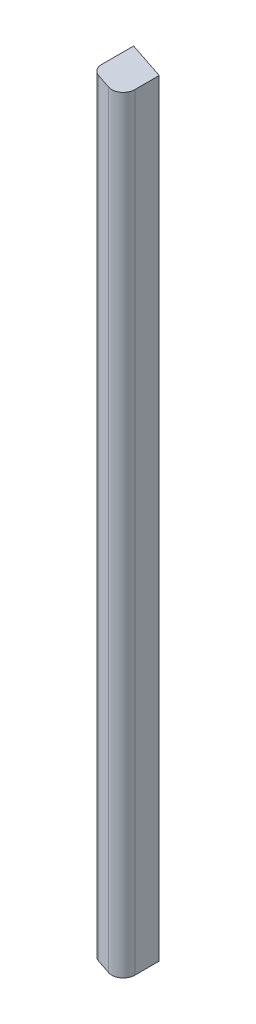
ISO-10303-21;
HEADER;
FILE_DESCRIPTION(('STEP AP214'),'2;1');
FILE_NAME('part.step','',(''),(''),'','','');
FILE_SCHEMA(('AUTOMOTIVE_DESIGN { 1 0 10303 214 1 1 1 1 }'));
ENDSEC;
DATA;
#1=APPLICATION_CONTEXT('core data for automotive mechanical design processes');
#2=APPLICATION_PROTOCOL_DEFINITION('international standard','automotive_design',2000,#1);
#3=PRODUCT_CONTEXT('',#1,'mechanical');
#4=PRODUCT('Part','Part','',(#3));
#5=PRODUCT_RELATED_PRODUCT_CATEGORY('part','',(#4));
#6=PRODUCT_DEFINITION_FORMATION('','',#4);
#7=PRODUCT_DEFINITION_CONTEXT('part definition',#1,'design');
#8=PRODUCT_DEFINITION('design','',#6,#7);
#9=PRODUCT_DEFINITION_SHAPE('','',#8);
#10=(LENGTH_UNIT() NAMED_UNIT(*) SI_UNIT(.MILLI.,.METRE.));
#11=(NAMED_UNIT(*) PLANE_ANGLE_UNIT() SI_UNIT($,.RADIAN.));
#12=(NAMED_UNIT(*) SI_UNIT($,.STERADIAN.) SOLID_ANGLE_UNIT());
#13=UNCERTAINTY_MEASURE_WITH_UNIT(LENGTH_MEASURE(1.E-05),#10,'distance_accuracy_value','');
#14=(GEOMETRIC_REPRESENTATION_CONTEXT(3) GLOBAL_UNCERTAINTY_ASSIGNED_CONTEXT((#13)) GLOBAL_UNIT_ASSIGNED_CONTEXT((#10,
#11,#12)) REPRESENTATION_CONTEXT('',''));
#15=CARTESIAN_POINT('',(0.,0.,0.));
#16=DIRECTION('',(0.,0.,1.));
#17=DIRECTION('',(1.,0.,0.));
#18=AXIS2_PLACEMENT_3D('',#15,#16,#17);
#19=CARTESIAN_POINT('',(-2.747264848109,10.86,8.977774605995));
#20=DIRECTION('',(0.315098987391905,0.,-0.949058811741715));
#21=DIRECTION('',(-0.949058811741715,0.,-0.315098987391905));
#22=AXIS2_PLACEMENT_3D('',#19,#20,#21);
#23=PLANE('',#22);
#24=DIRECTION('',(-0.949058811741715,0.,-0.315098987391905));
#25=VECTOR('',#24,1.);
#26=CARTESIAN_POINT('',(-2.747264848109,10.86,8.977774605995));
#27=LINE('',#26,#25);
#28=CARTESIAN_POINT('',(-2.947264848109,10.86,8.91137219057146));
#29=VERTEX_POINT('',#28);
#30=CARTESIAN_POINT('',(-2.74726484810889,10.86,8.97777460599463));
#31=VERTEX_POINT('',#30);
#32=EDGE_CURVE('E74',#29,#31,#27,.F.);
#33=ORIENTED_EDGE('',*,*,#32,.F.);
#34=DIRECTION('',(0.,-1.,0.));
#35=VECTOR('',#34,1.);
#36=CARTESIAN_POINT('',(-2.94726484810906,10.86,8.91137219057117));
#37=LINE('',#36,#35);
#38=CARTESIAN_POINT('',(-2.947264848109,0.86,8.91137219057146));
#39=VERTEX_POINT('',#38);
#40=EDGE_CURVE('E119',#39,#29,#37,.F.);
#41=ORIENTED_EDGE('',*,*,#40,.F.);
#42=DIRECTION('',(-0.949058811741715,0.,-0.315098987391905));
#43=VECTOR('',#42,1.);
#44=CARTESIAN_POINT('',(-2.747264848109,0.86,8.977774605995));
#45=LINE('',#44,#43);
#46=CARTESIAN_POINT('',(-2.74726484810889,0.86,8.97777460599463));
#47=VERTEX_POINT('',#46);
#48=EDGE_CURVE('E130',#47,#39,#45,.T.);
#49=ORIENTED_EDGE('',*,*,#48,.F.);
#50=DIRECTION('',(0.,-1.,0.));
#51=VECTOR('',#50,1.);
#52=CARTESIAN_POINT('',(-2.74726484810876,10.86,8.97777460599427));
#53=LINE('',#52,#51);
#54=EDGE_CURVE('E78',#31,#47,#53,.T.);
#55=ORIENTED_EDGE('',*,*,#54,.F.);
#56=EDGE_LOOP('',(#33,#41,#49,#55));
#57=FACE_BOUND('',#56,.T.);
#58=ADVANCED_FACE('F17',(#57),#23,.F.);
#59=CARTESIAN_POINT('',(-2.7,10.86,8.835415784233));
#60=DIRECTION('',(0.,-1.,0.));
#61=DIRECTION('',(0.,0.,-1.));
#62=AXIS2_PLACEMENT_3D('',#59,#60,#61);
#63=CYLINDRICAL_SURFACE('',#62,0.15);
#64=CARTESIAN_POINT('',(-2.7,0.86,8.835415784233));
#65=DIRECTION('',(0.,-1.,0.));
#66=DIRECTION('',(0.,0.,-1.));
#67=AXIS2_PLACEMENT_3D('',#64,#65,#66);
#68=CIRCLE('',#67,0.15);
#69=CARTESIAN_POINT('',(-2.55,0.86,8.835415784233));
#70=VERTEX_POINT('',#69);
#71=EDGE_CURVE('E83',#70,#47,#68,.T.);
#72=ORIENTED_EDGE('',*,*,#71,.F.);
#73=DIRECTION('',(0.,1.,0.));
#74=VECTOR('',#73,1.);
#75=CARTESIAN_POINT('',(-2.55,10.86,8.835415784233));
#76=LINE('',#75,#74);
#77=CARTESIAN_POINT('',(-2.55,10.86,8.835415784233));
#78=VERTEX_POINT('',#77);
#79=EDGE_CURVE('E80',#70,#78,#76,.T.);
#80=ORIENTED_EDGE('',*,*,#79,.T.);
#81=CARTESIAN_POINT('',(-2.7,10.86,8.835415784233));
#82=DIRECTION('',(0.,-1.,0.));
#83=DIRECTION('',(0.,0.,-1.));
#84=AXIS2_PLACEMENT_3D('',#81,#82,#83);
#85=CIRCLE('',#84,0.15);
#86=EDGE_CURVE('E20',#78,#31,#85,.T.);
#87=ORIENTED_EDGE('',*,*,#86,.T.);
#88=ORIENTED_EDGE('',*,*,#54,.T.);
#89=EDGE_LOOP('',(#72,#80,#87,#88));
#90=FACE_BOUND('',#89,.T.);
#91=ADVANCED_FACE('F81',(#90),#63,.T.);
#92=CARTESIAN_POINT('',(-2.9,10.86,8.76901336881));
#93=DIRECTION('',(0.,-1.,0.));
#94=DIRECTION('',(0.,0.,-1.));
#95=AXIS2_PLACEMENT_3D('',#92,#93,#94);
#96=CYLINDRICAL_SURFACE('',#95,0.15);
#97=CARTESIAN_POINT('',(-2.9,0.86,8.76901336881));
#98=DIRECTION('',(0.,-1.,0.));
#99=DIRECTION('',(0.,0.,-1.));
#100=AXIS2_PLACEMENT_3D('',#97,#98,#99);
#101=CIRCLE('',#100,0.15);
#102=CARTESIAN_POINT('',(-3.05,0.86,8.76901336881));
#103=VERTEX_POINT('',#102);
#104=EDGE_CURVE('E121',#39,#103,#101,.T.);
#105=ORIENTED_EDGE('',*,*,#104,.F.);
#106=ORIENTED_EDGE('',*,*,#40,.T.);
#107=CARTESIAN_POINT('',(-2.9,10.86,8.76901336881));
#108=DIRECTION('',(0.,-1.,0.));
#109=DIRECTION('',(0.,0.,-1.));
#110=AXIS2_PLACEMENT_3D('',#107,#108,#109);
#111=CIRCLE('',#110,0.15);
#112=CARTESIAN_POINT('',(-3.05,10.86,8.76901336881));
#113=VERTEX_POINT('',#112);
#114=EDGE_CURVE('E92',#29,#113,#111,.T.);
#115=ORIENTED_EDGE('',*,*,#114,.T.);
#116=DIRECTION('',(0.,1.,0.));
#117=VECTOR('',#116,1.);
#118=CARTESIAN_POINT('',(-3.05,10.86,8.76901336881));
#119=LINE('',#118,#117);
#120=EDGE_CURVE('E99',#113,#103,#119,.F.);
#121=ORIENTED_EDGE('',*,*,#120,.T.);
#122=EDGE_LOOP('',(#105,#106,#115,#121));
#123=FACE_BOUND('',#122,.T.);
#124=ADVANCED_FACE('F140',(#123),#96,.T.);
#125=CARTESIAN_POINT('',(-2.9,0.86,8.76901336881));
#126=DIRECTION('',(0.,-1.,0.));
#127=DIRECTION('',(0.,0.,-1.));
#128=AXIS2_PLACEMENT_3D('',#125,#126,#127);
#129=PLANE('',#128);
#130=ORIENTED_EDGE('',*,*,#71,.T.);
#131=ORIENTED_EDGE('',*,*,#48,.T.);
#132=ORIENTED_EDGE('',*,*,#104,.T.);
#133=DIRECTION('',(0.,0.,-1.));
#134=VECTOR('',#133,1.);
#135=CARTESIAN_POINT('',(-3.05,0.86,8.76901336881));
#136=LINE('',#135,#134);
#137=CARTESIAN_POINT('',(-3.04999999999998,0.86,8.35042513887791));
#138=VERTEX_POINT('',#137);
#139=EDGE_CURVE('E94',#103,#138,#136,.T.);
#140=ORIENTED_EDGE('',*,*,#139,.T.);
#141=DIRECTION('',(0.949058811741715,0.,0.315098987391905));
#142=VECTOR('',#141,1.);
#143=CARTESIAN_POINT('',(-2.55,0.86,8.516431177436));
#144=LINE('',#143,#142);
#145=CARTESIAN_POINT('',(-2.55,0.86,8.516431177436));
#146=VERTEX_POINT('',#145);
#147=EDGE_CURVE('E102',#138,#146,#144,.T.);
#148=ORIENTED_EDGE('',*,*,#147,.T.);
#149=DIRECTION('',(0.,0.,1.));
#150=VECTOR('',#149,1.);
#151=CARTESIAN_POINT('',(-2.55,0.86,8.516431177436));
#152=LINE('',#151,#150);
#153=EDGE_CURVE('E86',#146,#70,#152,.T.);
#154=ORIENTED_EDGE('',*,*,#153,.T.);
#155=EDGE_LOOP('',(#130,#131,#132,#140,#148,#154));
#156=FACE_BOUND('',#155,.T.);
#157=ADVANCED_FACE('F136',(#156),#129,.T.);
#158=CARTESIAN_POINT('',(-2.55,10.86,8.516431177436));
#159=DIRECTION('',(-1.,0.,0.));
#160=DIRECTION('',(0.,0.,1.));
#161=AXIS2_PLACEMENT_3D('',#158,#159,#160);
#162=PLANE('',#161);
#163=DIRECTION('',(0.,0.,-1.));
#164=VECTOR('',#163,1.);
#165=CARTESIAN_POINT('',(-2.55,10.86,8.76901336881));
#166=LINE('',#165,#164);
#167=CARTESIAN_POINT('',(-2.55,10.86,8.516431177436));
#168=VERTEX_POINT('',#167);
#169=EDGE_CURVE('E72',#168,#78,#166,.F.);
#170=ORIENTED_EDGE('',*,*,#169,.T.);
#171=ORIENTED_EDGE('',*,*,#79,.F.);
#172=ORIENTED_EDGE('',*,*,#153,.F.);
#173=DIRECTION('',(0.,1.,0.));
#174=VECTOR('',#173,1.);
#175=CARTESIAN_POINT('',(-2.55,10.86,8.516431177436));
#176=LINE('',#175,#174);
#177=EDGE_CURVE('E91',#146,#168,#176,.T.);
#178=ORIENTED_EDGE('',*,*,#177,.T.);
#179=EDGE_LOOP('',(#170,#171,#172,#178));
#180=FACE_BOUND('',#179,.T.);
#181=ADVANCED_FACE('F89',(#180),#162,.F.);
#182=CARTESIAN_POINT('',(-2.9,10.86,8.76901336881));
#183=DIRECTION('',(0.,-1.,0.));
#184=DIRECTION('',(0.,0.,-1.));
#185=AXIS2_PLACEMENT_3D('',#182,#183,#184);
#186=PLANE('',#185);
#187=ORIENTED_EDGE('',*,*,#114,.F.);
#188=ORIENTED_EDGE('',*,*,#32,.T.);
#189=ORIENTED_EDGE('',*,*,#86,.F.);
#190=ORIENTED_EDGE('',*,*,#169,.F.);
#191=DIRECTION('',(0.949058811741715,0.,0.315098987391905));
#192=VECTOR('',#191,1.);
#193=CARTESIAN_POINT('',(-2.55,10.86,8.516431177436));
#194=LINE('',#193,#192);
#195=CARTESIAN_POINT('',(-3.05,10.86,8.35042513887797));
#196=VERTEX_POINT('',#195);
#197=EDGE_CURVE('E26',#168,#196,#194,.F.);
#198=ORIENTED_EDGE('',*,*,#197,.T.);
#199=DIRECTION('',(0.,0.,-1.));
#200=VECTOR('',#199,1.);
#201=CARTESIAN_POINT('',(-3.05,10.86,8.76901336881));
#202=LINE('',#201,#200);
#203=EDGE_CURVE('E34',#196,#113,#202,.F.);
#204=ORIENTED_EDGE('',*,*,#203,.T.);
#205=EDGE_LOOP('',(#187,#188,#189,#190,#198,#204));
#206=FACE_BOUND('',#205,.T.);
#207=ADVANCED_FACE('F69',(#206),#186,.F.);
#208=CARTESIAN_POINT('',(-3.05,10.86,8.76901336881));
#209=DIRECTION('',(1.,0.,0.));
#210=DIRECTION('',(0.,0.,-1.));
#211=AXIS2_PLACEMENT_3D('',#208,#209,#210);
#212=PLANE('',#211);
#213=ORIENTED_EDGE('',*,*,#203,.F.);
#214=DIRECTION('',(0.,1.,0.));
#215=VECTOR('',#214,1.);
#216=CARTESIAN_POINT('',(-3.04999999999995,10.86,8.35042513887786));
#217=LINE('',#216,#215);
#218=EDGE_CURVE('E11',#196,#138,#217,.F.);
#219=ORIENTED_EDGE('',*,*,#218,.T.);
#220=ORIENTED_EDGE('',*,*,#139,.F.);
#221=ORIENTED_EDGE('',*,*,#120,.F.);
#222=EDGE_LOOP('',(#213,#219,#220,#221));
#223=FACE_BOUND('',#222,.T.);
#224=ADVANCED_FACE('F139',(#223),#212,.F.);
#225=CARTESIAN_POINT('',(-2.55,10.86,8.516431177436));
#226=DIRECTION('',(-0.315098987391905,0.,0.949058811741715));
#227=DIRECTION('',(0.949058811741715,0.,0.315098987391905));
#228=AXIS2_PLACEMENT_3D('',#225,#226,#227);
#229=PLANE('',#228);
#230=ORIENTED_EDGE('',*,*,#197,.F.);
#231=ORIENTED_EDGE('',*,*,#177,.F.);
#232=ORIENTED_EDGE('',*,*,#147,.F.);
#233=ORIENTED_EDGE('',*,*,#218,.F.);
#234=EDGE_LOOP('',(#230,#231,#232,#233));
#235=FACE_BOUND('',#234,.T.);
#236=ADVANCED_FACE('F142',(#235),#229,.F.);
#237=CLOSED_SHELL('',(#58,#91,#124,#157,#181,#207,#224,#236));
#238=MANIFOLD_SOLID_BREP('B1',#237);
#239=ADVANCED_BREP_SHAPE_REPRESENTATION('',(#18,#238),#14);
#240=SHAPE_DEFINITION_REPRESENTATION(#9,#239);
ENDSEC;
END-ISO-10303-21;
